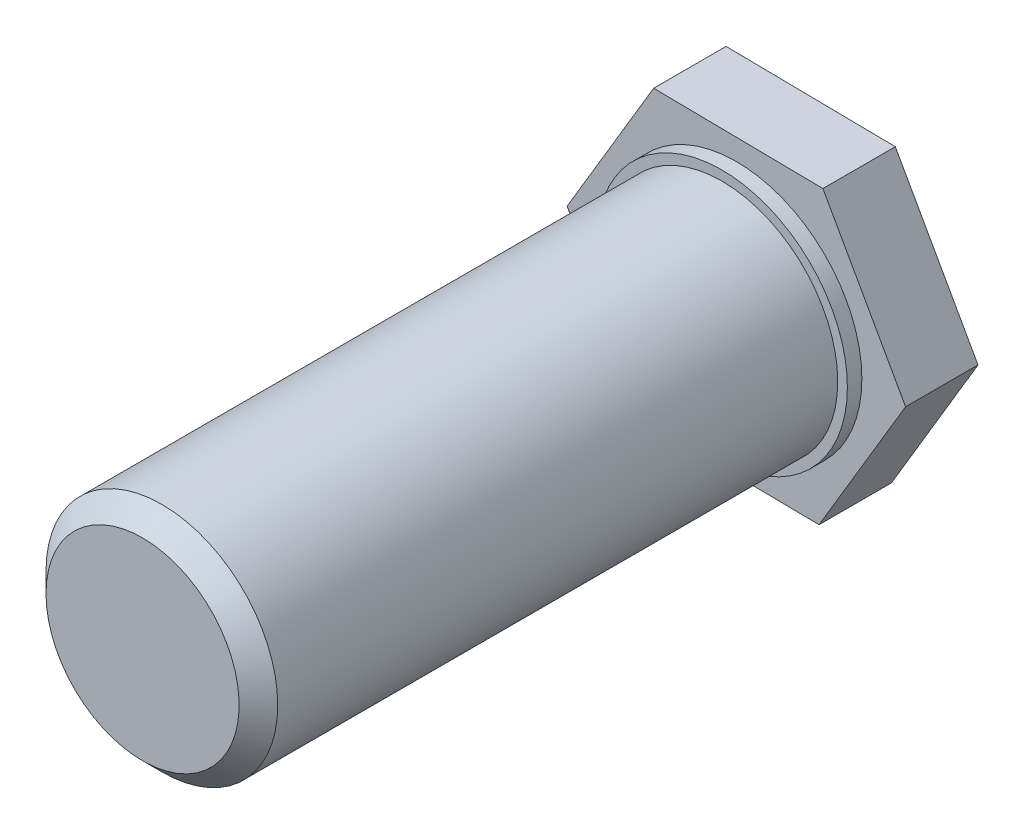
ISO-10303-21;
HEADER;
FILE_DESCRIPTION(('STEP AP214'),'2;1');
FILE_NAME('part.step','',(''),(''),'','','');
FILE_SCHEMA(('AUTOMOTIVE_DESIGN { 1 0 10303 214 1 1 1 1 }'));
ENDSEC;
DATA;
#1=APPLICATION_CONTEXT('core data for automotive mechanical design processes');
#2=APPLICATION_PROTOCOL_DEFINITION('international standard','automotive_design',2000,#1);
#3=PRODUCT_CONTEXT('',#1,'mechanical');
#4=PRODUCT('Part','Part','',(#3));
#5=PRODUCT_RELATED_PRODUCT_CATEGORY('part','',(#4));
#6=PRODUCT_DEFINITION_FORMATION('','',#4);
#7=PRODUCT_DEFINITION_CONTEXT('part definition',#1,'design');
#8=PRODUCT_DEFINITION('design','',#6,#7);
#9=PRODUCT_DEFINITION_SHAPE('','',#8);
#10=(LENGTH_UNIT() NAMED_UNIT(*) SI_UNIT(.MILLI.,.METRE.));
#11=(NAMED_UNIT(*) PLANE_ANGLE_UNIT() SI_UNIT($,.RADIAN.));
#12=(NAMED_UNIT(*) SI_UNIT($,.STERADIAN.) SOLID_ANGLE_UNIT());
#13=UNCERTAINTY_MEASURE_WITH_UNIT(LENGTH_MEASURE(1.E-05),#10,'distance_accuracy_value','');
#14=(GEOMETRIC_REPRESENTATION_CONTEXT(3) GLOBAL_UNCERTAINTY_ASSIGNED_CONTEXT((#13)) GLOBAL_UNIT_ASSIGNED_CONTEXT((#10,
#11,#12)) REPRESENTATION_CONTEXT('',''));
#15=CARTESIAN_POINT('',(0.,0.,0.));
#16=DIRECTION('',(0.,0.,1.));
#17=DIRECTION('',(1.,0.,0.));
#18=AXIS2_PLACEMENT_3D('',#15,#16,#17);
#19=CARTESIAN_POINT('',(3.50551491575966,-0.046367358620633,1.5));
#20=DIRECTION('',(-0.872562566026238,-0.488502372941737,0.));
#21=DIRECTION('',(0.488502372941737,-0.872562566026238,0.));
#22=AXIS2_PLACEMENT_3D('',#19,#20,#21);
#23=PLANE('',#22);
#24=DIRECTION('',(-0.488502372941737,0.872562566026238,0.));
#25=VECTOR('',#24,1.);
#26=CARTESIAN_POINT('',(3.50551491575966,-0.046367358620633,0.));
#27=LINE('',#26,#25);
#28=CARTESIAN_POINT('',(3.50551491575966,-0.046367358620633,0.));
#29=VERTEX_POINT('',#28);
#30=CARTESIAN_POINT('',(1.79291276835168,3.01268129108281,0.));
#31=VERTEX_POINT('',#30);
#32=EDGE_CURVE('E136',#29,#31,#27,.T.);
#33=ORIENTED_EDGE('',*,*,#32,.T.);
#34=DIRECTION('',(0.,0.,-1.));
#35=VECTOR('',#34,1.);
#36=CARTESIAN_POINT('',(1.79291276835168,3.01268129108281,1.5));
#37=LINE('',#36,#35);
#38=CARTESIAN_POINT('',(1.79291276835168,3.01268129108281,1.5));
#39=VERTEX_POINT('',#38);
#40=EDGE_CURVE('E164',#39,#31,#37,.T.);
#41=ORIENTED_EDGE('',*,*,#40,.F.);
#42=DIRECTION('',(-0.488502372941737,0.872562566026238,0.));
#43=VECTOR('',#42,1.);
#44=CARTESIAN_POINT('',(3.50551491575966,-0.046367358620633,1.5));
#45=LINE('',#44,#43);
#46=CARTESIAN_POINT('',(3.50551491575966,-0.046367358620633,1.5));
#47=VERTEX_POINT('',#46);
#48=EDGE_CURVE('E153',#47,#39,#45,.T.);
#49=ORIENTED_EDGE('',*,*,#48,.F.);
#50=DIRECTION('',(0.,0.,-1.));
#51=VECTOR('',#50,1.);
#52=CARTESIAN_POINT('',(3.50551491575966,-0.046367358620633,1.5));
#53=LINE('',#52,#51);
#54=EDGE_CURVE('E132',#47,#29,#53,.T.);
#55=ORIENTED_EDGE('',*,*,#54,.T.);
#56=EDGE_LOOP('',(#33,#41,#49,#55));
#57=FACE_BOUND('',#56,.T.);
#58=ADVANCED_FACE('F44',(#57),#23,.F.);
#59=CARTESIAN_POINT('',(1.79291276835168,3.01268129108281,1.5));
#60=DIRECTION('',(-0.0132258182365951,-0.999912535040927,0.));
#61=DIRECTION('',(0.999912535040927,-0.0132258182365951,0.));
#62=AXIS2_PLACEMENT_3D('',#59,#60,#61);
#63=PLANE('',#62);
#64=DIRECTION('',(-0.999912535040927,0.0132258182365951,0.));
#65=VECTOR('',#64,1.);
#66=CARTESIAN_POINT('',(1.79291276835168,3.01268129108281,0.));
#67=LINE('',#66,#65);
#68=CARTESIAN_POINT('',(-1.71260214740798,3.05904864970345,0.));
#69=VERTEX_POINT('',#68);
#70=EDGE_CURVE('E140',#31,#69,#67,.T.);
#71=ORIENTED_EDGE('',*,*,#70,.T.);
#72=DIRECTION('',(0.,0.,-1.));
#73=VECTOR('',#72,1.);
#74=CARTESIAN_POINT('',(-1.71260214740798,3.05904864970345,1.5));
#75=LINE('',#74,#73);
#76=CARTESIAN_POINT('',(-1.71260214740798,3.05904864970345,1.5));
#77=VERTEX_POINT('',#76);
#78=EDGE_CURVE('E160',#77,#69,#75,.T.);
#79=ORIENTED_EDGE('',*,*,#78,.F.);
#80=DIRECTION('',(-0.999912535040927,0.0132258182365951,0.));
#81=VECTOR('',#80,1.);
#82=CARTESIAN_POINT('',(1.79291276835168,3.01268129108281,1.5));
#83=LINE('',#82,#81);
#84=EDGE_CURVE('E101',#39,#77,#83,.T.);
#85=ORIENTED_EDGE('',*,*,#84,.F.);
#86=ORIENTED_EDGE('',*,*,#40,.T.);
#87=EDGE_LOOP('',(#71,#79,#85,#86));
#88=FACE_BOUND('',#87,.T.);
#89=ADVANCED_FACE('F190',(#88),#63,.F.);
#90=CARTESIAN_POINT('',(-1.71260214740798,3.05904864970345,1.5));
#91=DIRECTION('',(0.859336747789643,-0.51141016209919,0.));
#92=DIRECTION('',(0.51141016209919,0.859336747789643,0.));
#93=AXIS2_PLACEMENT_3D('',#90,#91,#92);
#94=PLANE('',#93);
#95=DIRECTION('',(-0.51141016209919,-0.859336747789643,0.));
#96=VECTOR('',#95,1.);
#97=CARTESIAN_POINT('',(-1.71260214740798,3.05904864970345,0.));
#98=LINE('',#97,#96);
#99=CARTESIAN_POINT('',(-3.50551491575966,0.046367358620633,0.));
#100=VERTEX_POINT('',#99);
#101=EDGE_CURVE('E144',#69,#100,#98,.T.);
#102=ORIENTED_EDGE('',*,*,#101,.T.);
#103=DIRECTION('',(0.,0.,-1.));
#104=VECTOR('',#103,1.);
#105=CARTESIAN_POINT('',(-3.50551491575966,0.046367358620633,1.5));
#106=LINE('',#105,#104);
#107=CARTESIAN_POINT('',(-3.50551491575966,0.046367358620633,1.5));
#108=VERTEX_POINT('',#107);
#109=EDGE_CURVE('E125',#108,#100,#106,.T.);
#110=ORIENTED_EDGE('',*,*,#109,.F.);
#111=DIRECTION('',(-0.51141016209919,-0.859336747789643,0.));
#112=VECTOR('',#111,1.);
#113=CARTESIAN_POINT('',(-1.71260214740798,3.05904864970345,1.5));
#114=LINE('',#113,#112);
#115=EDGE_CURVE('E114',#77,#108,#114,.T.);
#116=ORIENTED_EDGE('',*,*,#115,.F.);
#117=ORIENTED_EDGE('',*,*,#78,.T.);
#118=EDGE_LOOP('',(#102,#110,#116,#117));
#119=FACE_BOUND('',#118,.T.);
#120=ADVANCED_FACE('F193',(#119),#94,.F.);
#121=CARTESIAN_POINT('',(-3.50551491575966,0.046367358620633,1.5));
#122=DIRECTION('',(0.872562566026238,0.488502372941737,0.));
#123=DIRECTION('',(-0.488502372941737,0.872562566026238,0.));
#124=AXIS2_PLACEMENT_3D('',#121,#122,#123);
#125=PLANE('',#124);
#126=DIRECTION('',(0.488502372941737,-0.872562566026238,0.));
#127=VECTOR('',#126,1.);
#128=CARTESIAN_POINT('',(-3.50551491575966,0.046367358620633,0.));
#129=LINE('',#128,#127);
#130=CARTESIAN_POINT('',(-1.79291276835168,-3.01268129108282,0.));
#131=VERTEX_POINT('',#130);
#132=EDGE_CURVE('E123',#100,#131,#129,.T.);
#133=ORIENTED_EDGE('',*,*,#132,.T.);
#134=DIRECTION('',(0.,0.,-1.));
#135=VECTOR('',#134,1.);
#136=CARTESIAN_POINT('',(-1.79291276835168,-3.01268129108282,1.5));
#137=LINE('',#136,#135);
#138=CARTESIAN_POINT('',(-1.79291276835168,-3.01268129108282,1.5));
#139=VERTEX_POINT('',#138);
#140=EDGE_CURVE('E120',#139,#131,#137,.T.);
#141=ORIENTED_EDGE('',*,*,#140,.F.);
#142=DIRECTION('',(0.488502372941737,-0.872562566026238,0.));
#143=VECTOR('',#142,1.);
#144=CARTESIAN_POINT('',(-3.50551491575966,0.046367358620633,1.5));
#145=LINE('',#144,#143);
#146=EDGE_CURVE('E108',#108,#139,#145,.T.);
#147=ORIENTED_EDGE('',*,*,#146,.F.);
#148=ORIENTED_EDGE('',*,*,#109,.T.);
#149=EDGE_LOOP('',(#133,#141,#147,#148));
#150=FACE_BOUND('',#149,.T.);
#151=ADVANCED_FACE('F121',(#150),#125,.F.);
#152=CARTESIAN_POINT('',(-1.79291276835168,-3.01268129108282,1.5));
#153=DIRECTION('',(0.0132258182365947,0.999912535040927,0.));
#154=DIRECTION('',(-0.999912535040927,0.0132258182365947,0.));
#155=AXIS2_PLACEMENT_3D('',#152,#153,#154);
#156=PLANE('',#155);
#157=DIRECTION('',(0.999912535040927,-0.0132258182365947,0.));
#158=VECTOR('',#157,1.);
#159=CARTESIAN_POINT('',(-1.79291276835168,-3.01268129108282,0.));
#160=LINE('',#159,#158);
#161=CARTESIAN_POINT('',(1.71260214740798,-3.05904864970345,0.));
#162=VERTEX_POINT('',#161);
#163=EDGE_CURVE('E86',#131,#162,#160,.T.);
#164=ORIENTED_EDGE('',*,*,#163,.T.);
#165=DIRECTION('',(0.,0.,-1.));
#166=VECTOR('',#165,1.);
#167=CARTESIAN_POINT('',(1.71260214740798,-3.05904864970345,1.5));
#168=LINE('',#167,#166);
#169=CARTESIAN_POINT('',(1.71260214740798,-3.05904864970345,1.5));
#170=VERTEX_POINT('',#169);
#171=EDGE_CURVE('E126',#170,#162,#168,.T.);
#172=ORIENTED_EDGE('',*,*,#171,.F.);
#173=DIRECTION('',(0.999912535040927,-0.0132258182365947,0.));
#174=VECTOR('',#173,1.);
#175=CARTESIAN_POINT('',(-1.79291276835168,-3.01268129108282,1.5));
#176=LINE('',#175,#174);
#177=EDGE_CURVE('E112',#139,#170,#176,.T.);
#178=ORIENTED_EDGE('',*,*,#177,.F.);
#179=ORIENTED_EDGE('',*,*,#140,.T.);
#180=EDGE_LOOP('',(#164,#172,#178,#179));
#181=FACE_BOUND('',#180,.T.);
#182=ADVANCED_FACE('F128',(#181),#156,.F.);
#183=CARTESIAN_POINT('',(1.71260214740798,-3.05904864970345,1.5));
#184=DIRECTION('',(-0.859336747789643,0.51141016209919,0.));
#185=DIRECTION('',(-0.51141016209919,-0.859336747789643,0.));
#186=AXIS2_PLACEMENT_3D('',#183,#184,#185);
#187=PLANE('',#186);
#188=DIRECTION('',(0.51141016209919,0.859336747789643,0.));
#189=VECTOR('',#188,1.);
#190=CARTESIAN_POINT('',(1.71260214740798,-3.05904864970345,0.));
#191=LINE('',#190,#189);
#192=EDGE_CURVE('E92',#162,#29,#191,.T.);
#193=ORIENTED_EDGE('',*,*,#192,.T.);
#194=ORIENTED_EDGE('',*,*,#54,.F.);
#195=DIRECTION('',(0.51141016209919,0.859336747789643,0.));
#196=VECTOR('',#195,1.);
#197=CARTESIAN_POINT('',(1.71260214740798,-3.05904864970345,1.5));
#198=LINE('',#197,#196);
#199=EDGE_CURVE('E63',#170,#47,#198,.T.);
#200=ORIENTED_EDGE('',*,*,#199,.F.);
#201=ORIENTED_EDGE('',*,*,#171,.T.);
#202=EDGE_LOOP('',(#193,#194,#200,#201));
#203=FACE_BOUND('',#202,.T.);
#204=ADVANCED_FACE('F198',(#203),#187,.F.);
#205=CARTESIAN_POINT('',(0.,0.,1.5));
#206=DIRECTION('',(0.,0.,1.));
#207=DIRECTION('',(1.,0.,0.));
#208=AXIS2_PLACEMENT_3D('',#205,#206,#207);
#209=PLANE('',#208);
#210=CARTESIAN_POINT('',(0.,0.,1.5));
#211=DIRECTION('',(0.,0.,1.));
#212=DIRECTION('',(1.,0.,0.));
#213=AXIS2_PLACEMENT_3D('',#210,#211,#212);
#214=CIRCLE('',#213,2.6);
#215=CARTESIAN_POINT('',(2.6,0.,1.5));
#216=VERTEX_POINT('',#215);
#217=EDGE_CURVE('E166',#216,#216,#214,.T.);
#218=ORIENTED_EDGE('',*,*,#217,.F.);
#219=EDGE_LOOP('',(#218));
#220=FACE_BOUND('',#219,.T.);
#221=ORIENTED_EDGE('',*,*,#48,.T.);
#222=ORIENTED_EDGE('',*,*,#84,.T.);
#223=ORIENTED_EDGE('',*,*,#115,.T.);
#224=ORIENTED_EDGE('',*,*,#146,.T.);
#225=ORIENTED_EDGE('',*,*,#177,.T.);
#226=ORIENTED_EDGE('',*,*,#199,.T.);
#227=EDGE_LOOP('',(#221,#222,#223,#224,#225,#226));
#228=FACE_BOUND('',#227,.T.);
#229=ADVANCED_FACE('F110',(#220,#228),#209,.T.);
#230=CARTESIAN_POINT('',(0.,0.,0.));
#231=DIRECTION('',(0.,0.,1.));
#232=DIRECTION('',(1.,0.,0.));
#233=AXIS2_PLACEMENT_3D('',#230,#231,#232);
#234=PLANE('',#233);
#235=ORIENTED_EDGE('',*,*,#32,.F.);
#236=ORIENTED_EDGE('',*,*,#192,.F.);
#237=ORIENTED_EDGE('',*,*,#163,.F.);
#238=ORIENTED_EDGE('',*,*,#132,.F.);
#239=ORIENTED_EDGE('',*,*,#101,.F.);
#240=ORIENTED_EDGE('',*,*,#70,.F.);
#241=EDGE_LOOP('',(#235,#236,#237,#238,#239,#240));
#242=FACE_BOUND('',#241,.T.);
#243=ADVANCED_FACE('F196',(#242),#234,.F.);
#244=CARTESIAN_POINT('',(0.,0.,1.8));
#245=DIRECTION('',(0.,0.,-1.));
#246=DIRECTION('',(-1.,0.,0.));
#247=AXIS2_PLACEMENT_3D('',#244,#245,#246);
#248=CYLINDRICAL_SURFACE('',#247,2.6);
#249=CARTESIAN_POINT('',(0.,0.,1.8));
#250=DIRECTION('',(0.,0.,1.));
#251=DIRECTION('',(1.,0.,0.));
#252=AXIS2_PLACEMENT_3D('',#249,#250,#251);
#253=CIRCLE('',#252,2.6);
#254=CARTESIAN_POINT('',(2.6,0.,1.8));
#255=VERTEX_POINT('',#254);
#256=EDGE_CURVE('E141',#255,#255,#253,.T.);
#257=ORIENTED_EDGE('',*,*,#256,.F.);
#258=EDGE_LOOP('',(#257));
#259=FACE_BOUND('',#258,.T.);
#260=ORIENTED_EDGE('',*,*,#217,.T.);
#261=EDGE_LOOP('',(#260));
#262=FACE_BOUND('',#261,.T.);
#263=ADVANCED_FACE('F242',(#259,#262),#248,.T.);
#264=CARTESIAN_POINT('',(0.,0.,1.8));
#265=DIRECTION('',(0.,0.,1.));
#266=DIRECTION('',(1.,0.,0.));
#267=AXIS2_PLACEMENT_3D('',#264,#265,#266);
#268=PLANE('',#267);
#269=CARTESIAN_POINT('',(0.,0.,1.8));
#270=DIRECTION('',(0.,0.,1.));
#271=DIRECTION('',(1.,0.,0.));
#272=AXIS2_PLACEMENT_3D('',#269,#270,#271);
#273=CIRCLE('',#272,2.4);
#274=CARTESIAN_POINT('',(2.4,0.,1.8));
#275=VERTEX_POINT('',#274);
#276=EDGE_CURVE('E169',#275,#275,#273,.T.);
#277=ORIENTED_EDGE('',*,*,#276,.F.);
#278=EDGE_LOOP('',(#277));
#279=FACE_BOUND('',#278,.T.);
#280=ORIENTED_EDGE('',*,*,#256,.T.);
#281=EDGE_LOOP('',(#280));
#282=FACE_BOUND('',#281,.T.);
#283=ADVANCED_FACE('F257',(#279,#282),#268,.T.);
#284=CARTESIAN_POINT('',(0.,0.,13.8));
#285=DIRECTION('',(0.,0.,-1.));
#286=DIRECTION('',(-1.,0.,0.));
#287=AXIS2_PLACEMENT_3D('',#284,#285,#286);
#288=CYLINDRICAL_SURFACE('',#287,2.4);
#289=CARTESIAN_POINT('',(0.,0.,13.4));
#290=DIRECTION('',(0.,0.,1.));
#291=DIRECTION('',(1.,0.,0.));
#292=AXIS2_PLACEMENT_3D('',#289,#290,#291);
#293=CIRCLE('',#292,2.4);
#294=CARTESIAN_POINT('',(-2.4,0.,13.4));
#295=VERTEX_POINT('',#294);
#296=EDGE_CURVE('E11',#295,#295,#293,.F.);
#297=ORIENTED_EDGE('',*,*,#296,.T.);
#298=EDGE_LOOP('',(#297));
#299=FACE_BOUND('',#298,.T.);
#300=ORIENTED_EDGE('',*,*,#276,.T.);
#301=EDGE_LOOP('',(#300));
#302=FACE_BOUND('',#301,.T.);
#303=ADVANCED_FACE('F268',(#299,#302),#288,.T.);
#304=CARTESIAN_POINT('',(0.,0.,13.8));
#305=DIRECTION('',(0.,0.,1.));
#306=DIRECTION('',(1.,0.,0.));
#307=AXIS2_PLACEMENT_3D('',#304,#305,#306);
#308=PLANE('',#307);
#309=CARTESIAN_POINT('',(0.,0.,13.8));
#310=DIRECTION('',(0.,0.,1.));
#311=DIRECTION('',(1.,0.,0.));
#312=AXIS2_PLACEMENT_3D('',#309,#310,#311);
#313=CIRCLE('',#312,2.);
#314=CARTESIAN_POINT('',(-2.,0.,13.8));
#315=VERTEX_POINT('',#314);
#316=EDGE_CURVE('E55',#315,#315,#313,.T.);
#317=ORIENTED_EDGE('',*,*,#316,.T.);
#318=EDGE_LOOP('',(#317));
#319=FACE_BOUND('',#318,.T.);
#320=ADVANCED_FACE('F279',(#319),#308,.T.);
#321=CARTESIAN_POINT('',(0.,0.,13.8));
#322=DIRECTION('',(0.,0.,-1.));
#323=DIRECTION('',(-1.,0.,0.));
#324=AXIS2_PLACEMENT_3D('',#321,#322,#323);
#325=CONICAL_SURFACE('',#324,2.,0.785398163397449);
#326=CARTESIAN_POINT('',(-2.4,0.,13.4));
#327=CARTESIAN_POINT('',(-2.39583333333333,0.,13.4041666666667));
#328=CARTESIAN_POINT('',(-2.39166666666667,0.,13.4083333333333));
#329=CARTESIAN_POINT('',(-2.38333333333333,0.,13.4166666666667));
#330=CARTESIAN_POINT('',(-2.37916666666667,0.,13.4208333333333));
#331=CARTESIAN_POINT('',(-2.37083333333333,0.,13.4291666666667));
#332=CARTESIAN_POINT('',(-2.36666666666667,0.,13.4333333333333));
#333=CARTESIAN_POINT('',(-2.35833333333333,0.,13.4416666666667));
#334=CARTESIAN_POINT('',(-2.35416666666667,0.,13.4458333333333));
#335=CARTESIAN_POINT('',(-2.34583333333333,0.,13.4541666666667));
#336=CARTESIAN_POINT('',(-2.34166666666667,0.,13.4583333333333));
#337=CARTESIAN_POINT('',(-2.33333333333333,0.,13.4666666666667));
#338=CARTESIAN_POINT('',(-2.32916666666667,0.,13.4708333333333));
#339=CARTESIAN_POINT('',(-2.32083333333333,0.,13.4791666666667));
#340=CARTESIAN_POINT('',(-2.31666666666667,0.,13.4833333333333));
#341=CARTESIAN_POINT('',(-2.30833333333333,0.,13.4916666666667));
#342=CARTESIAN_POINT('',(-2.30416666666667,0.,13.4958333333333));
#343=CARTESIAN_POINT('',(-2.29583333333333,0.,13.5041666666667));
#344=CARTESIAN_POINT('',(-2.29166666666667,0.,13.5083333333333));
#345=CARTESIAN_POINT('',(-2.28333333333333,0.,13.5166666666667));
#346=CARTESIAN_POINT('',(-2.27916666666667,0.,13.5208333333333));
#347=CARTESIAN_POINT('',(-2.27083333333333,0.,13.5291666666667));
#348=CARTESIAN_POINT('',(-2.26666666666667,0.,13.5333333333333));
#349=CARTESIAN_POINT('',(-2.25833333333333,0.,13.5416666666667));
#350=CARTESIAN_POINT('',(-2.25416666666667,0.,13.5458333333333));
#351=CARTESIAN_POINT('',(-2.24583333333333,0.,13.5541666666667));
#352=CARTESIAN_POINT('',(-2.24166666666667,0.,13.5583333333333));
#353=CARTESIAN_POINT('',(-2.23333333333333,0.,13.5666666666667));
#354=CARTESIAN_POINT('',(-2.22916666666667,0.,13.5708333333333));
#355=CARTESIAN_POINT('',(-2.22083333333333,0.,13.5791666666667));
#356=CARTESIAN_POINT('',(-2.21666666666667,0.,13.5833333333333));
#357=CARTESIAN_POINT('',(-2.20833333333333,0.,13.5916666666667));
#358=CARTESIAN_POINT('',(-2.20416666666667,0.,13.5958333333333));
#359=CARTESIAN_POINT('',(-2.19583333333333,0.,13.6041666666667));
#360=CARTESIAN_POINT('',(-2.19166666666667,0.,13.6083333333333));
#361=CARTESIAN_POINT('',(-2.18333333333333,0.,13.6166666666667));
#362=CARTESIAN_POINT('',(-2.17916666666667,0.,13.6208333333333));
#363=CARTESIAN_POINT('',(-2.17083333333333,0.,13.6291666666667));
#364=CARTESIAN_POINT('',(-2.16666666666667,0.,13.6333333333333));
#365=CARTESIAN_POINT('',(-2.15833333333333,0.,13.6416666666667));
#366=CARTESIAN_POINT('',(-2.15416666666667,0.,13.6458333333333));
#367=CARTESIAN_POINT('',(-2.14583333333333,0.,13.6541666666667));
#368=CARTESIAN_POINT('',(-2.14166666666667,0.,13.6583333333333));
#369=CARTESIAN_POINT('',(-2.13333333333333,0.,13.6666666666667));
#370=CARTESIAN_POINT('',(-2.12916666666667,0.,13.6708333333333));
#371=CARTESIAN_POINT('',(-2.12083333333333,0.,13.6791666666667));
#372=CARTESIAN_POINT('',(-2.11666666666667,0.,13.6833333333333));
#373=CARTESIAN_POINT('',(-2.10833333333333,0.,13.6916666666667));
#374=CARTESIAN_POINT('',(-2.10416666666667,0.,13.6958333333333));
#375=CARTESIAN_POINT('',(-2.09583333333333,0.,13.7041666666667));
#376=CARTESIAN_POINT('',(-2.09166666666667,0.,13.7083333333333));
#377=CARTESIAN_POINT('',(-2.08333333333333,0.,13.7166666666667));
#378=CARTESIAN_POINT('',(-2.07916666666667,0.,13.7208333333333));
#379=CARTESIAN_POINT('',(-2.07083333333333,0.,13.7291666666667));
#380=CARTESIAN_POINT('',(-2.06666666666667,0.,13.7333333333333));
#381=CARTESIAN_POINT('',(-2.05833333333333,0.,13.7416666666667));
#382=CARTESIAN_POINT('',(-2.05416666666667,0.,13.7458333333333));
#383=CARTESIAN_POINT('',(-2.04583333333333,0.,13.7541666666667));
#384=CARTESIAN_POINT('',(-2.04166666666667,0.,13.7583333333333));
#385=CARTESIAN_POINT('',(-2.03333333333333,0.,13.7666666666667));
#386=CARTESIAN_POINT('',(-2.02916666666667,0.,13.7708333333333));
#387=CARTESIAN_POINT('',(-2.02083333333333,0.,13.7791666666667));
#388=CARTESIAN_POINT('',(-2.01666666666667,0.,13.7833333333333));
#389=CARTESIAN_POINT('',(-2.00833333333333,0.,13.7916666666667));
#390=CARTESIAN_POINT('',(-2.00416666666667,0.,13.7958333333333));
#391=CARTESIAN_POINT('',(-2.,0.,13.8));
#392=B_SPLINE_CURVE_WITH_KNOTS('',3,(#326,#327,#328,#329,#330,#331,#332,#333,#334,#335,#336,
#337,#338,#339,#340,#341,#342,#343,#344,#345,#346,#347,#348,#349,#350,#351,#352,#353,#354,#355,
#356,#357,#358,#359,#360,#361,#362,#363,#364,#365,#366,#367,#368,#369,#370,#371,#372,#373,#374,
#375,#376,#377,#378,#379,#380,#381,#382,#383,#384,#385,#386,#387,#388,#389,#390,#391),
.UNSPECIFIED.,.F.,.F.,(4,2,2,2,2,2,2,2,2,2,2,2,2,2,2,2,2,2,2,2,2,2,2,2,2,2,2,2,2,2,2,2,4),(0.,
0.0176776695296627,0.0353553390593266,0.0530330085889904,0.0707106781186546,0.0883883476483173,
0.106066017177981,0.123743686707645,0.141421356237309,0.159099025766973,0.176776695296635,
0.1944543648263,0.212132034355964,0.229809703885627,0.24748737341529,0.265165042944954,
0.282842712474618,0.300520382004282,0.318198051533946,0.335875721063609,0.353553390593273,
0.371231060122936,0.3889087296526,0.406586399182263,0.424264068711927,0.441941738241591,
0.459619407771255,0.477297077300919,0.494974746830581,0.512652416360245,0.530330085889909,
0.548007755419573,0.565685424949237),.UNSPECIFIED.);
#393=EDGE_CURVE('BSEAM47',#295,#315,#392,.T.);
#394=ORIENTED_EDGE('',*,*,#296,.F.);
#395=ORIENTED_EDGE('',*,*,#316,.F.);
#396=ORIENTED_EDGE('',*,*,#393,.T.);
#397=ORIENTED_EDGE('',*,*,#393,.F.);
#398=EDGE_LOOP('',(#394,#396,#395,#397));
#399=FACE_BOUND('',#398,.T.);
#400=ADVANCED_FACE('F47',(#399),#325,.T.);
#401=CLOSED_SHELL('',(#58,#89,#120,#151,#182,#204,#229,#243,#263,#283,#303,#320,#400));
#402=MANIFOLD_SOLID_BREP('B2',#401);
#403=ADVANCED_BREP_SHAPE_REPRESENTATION('',(#18,#402),#14);
#404=SHAPE_DEFINITION_REPRESENTATION(#9,#403);
ENDSEC;
END-ISO-10303-21;
